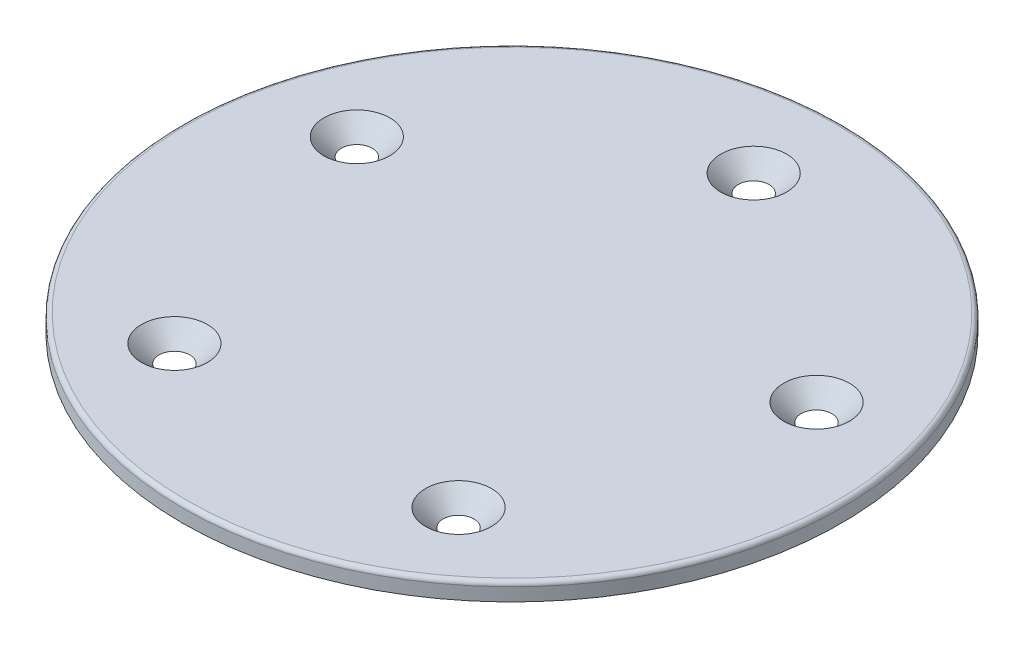
ISO-10303-21;
HEADER;
FILE_DESCRIPTION(('STEP AP214'),'2;1');
FILE_NAME('part.step','',(''),(''),'','','');
FILE_SCHEMA(('AUTOMOTIVE_DESIGN { 1 0 10303 214 1 1 1 1 }'));
ENDSEC;
DATA;
#1=APPLICATION_CONTEXT('core data for automotive mechanical design processes');
#2=APPLICATION_PROTOCOL_DEFINITION('international standard','automotive_design',2000,#1);
#3=PRODUCT_CONTEXT('',#1,'mechanical');
#4=PRODUCT('Part','Part','',(#3));
#5=PRODUCT_RELATED_PRODUCT_CATEGORY('part','',(#4));
#6=PRODUCT_DEFINITION_FORMATION('','',#4);
#7=PRODUCT_DEFINITION_CONTEXT('part definition',#1,'design');
#8=PRODUCT_DEFINITION('design','',#6,#7);
#9=PRODUCT_DEFINITION_SHAPE('','',#8);
#10=(LENGTH_UNIT() NAMED_UNIT(*) SI_UNIT(.MILLI.,.METRE.));
#11=(NAMED_UNIT(*) PLANE_ANGLE_UNIT() SI_UNIT($,.RADIAN.));
#12=(NAMED_UNIT(*) SI_UNIT($,.STERADIAN.) SOLID_ANGLE_UNIT());
#13=UNCERTAINTY_MEASURE_WITH_UNIT(LENGTH_MEASURE(1.E-05),#10,'distance_accuracy_value','');
#14=(GEOMETRIC_REPRESENTATION_CONTEXT(3) GLOBAL_UNCERTAINTY_ASSIGNED_CONTEXT((#13)) GLOBAL_UNIT_ASSIGNED_CONTEXT((#10,
#11,#12)) REPRESENTATION_CONTEXT('',''));
#15=CARTESIAN_POINT('',(0.,0.,0.));
#16=DIRECTION('',(0.,0.,1.));
#17=DIRECTION('',(1.,0.,0.));
#18=AXIS2_PLACEMENT_3D('',#15,#16,#17);
#19=CARTESIAN_POINT('',(0.,2.,0.));
#20=DIRECTION('',(0.,-1.,0.));
#21=DIRECTION('',(0.,0.,-1.));
#22=AXIS2_PLACEMENT_3D('',#19,#20,#21);
#23=CYLINDRICAL_SURFACE('',#22,37.5);
#24=CARTESIAN_POINT('',(0.,1.5,0.));
#25=DIRECTION('',(0.,1.,0.));
#26=DIRECTION('',(0.,0.,1.));
#27=AXIS2_PLACEMENT_3D('',#24,#25,#26);
#28=CIRCLE('',#27,37.5);
#29=CARTESIAN_POINT('',(0.,1.5,37.5));
#30=VERTEX_POINT('',#29);
#31=EDGE_CURVE('E10',#30,#30,#28,.F.);
#32=ORIENTED_EDGE('',*,*,#31,.T.);
#33=EDGE_LOOP('',(#32));
#34=FACE_BOUND('',#33,.T.);
#35=CARTESIAN_POINT('',(0.,0.,0.));
#36=DIRECTION('',(0.,1.,0.));
#37=DIRECTION('',(0.,0.,1.));
#38=AXIS2_PLACEMENT_3D('',#35,#36,#37);
#39=CIRCLE('',#38,37.5);
#40=CARTESIAN_POINT('',(0.,0.,37.5));
#41=VERTEX_POINT('',#40);
#42=EDGE_CURVE('E81',#41,#41,#39,.T.);
#43=ORIENTED_EDGE('',*,*,#42,.T.);
#44=EDGE_LOOP('',(#43));
#45=FACE_BOUND('',#44,.T.);
#46=ADVANCED_FACE('F45',(#34,#45),#23,.T.);
#47=CARTESIAN_POINT('',(0.,2.,0.));
#48=DIRECTION('',(0.,1.,0.));
#49=DIRECTION('',(0.,0.,1.));
#50=AXIS2_PLACEMENT_3D('',#47,#48,#49);
#51=PLANE('',#50);
#52=CARTESIAN_POINT('',(0.,2.,0.));
#53=DIRECTION('',(0.,1.,0.));
#54=DIRECTION('',(0.,0.,1.));
#55=AXIS2_PLACEMENT_3D('',#52,#53,#54);
#56=CIRCLE('',#55,37.);
#57=CARTESIAN_POINT('',(0.,2.,37.));
#58=VERTEX_POINT('',#57);
#59=EDGE_CURVE('E53',#58,#58,#56,.T.);
#60=ORIENTED_EDGE('',*,*,#59,.T.);
#61=EDGE_LOOP('',(#60));
#62=FACE_BOUND('',#61,.T.);
#63=CARTESIAN_POINT('',(-16.1640944380432,2.,22.2479673453109));
#64=DIRECTION('',(0.,1.,0.));
#65=DIRECTION('',(0.,0.,1.));
#66=AXIS2_PLACEMENT_3D('',#63,#64,#65);
#67=CIRCLE('',#66,3.75000000000004);
#68=CARTESIAN_POINT('',(-16.1640944380432,2.,25.997967345311));
#69=VERTEX_POINT('',#68);
#70=EDGE_CURVE('E58',#69,#69,#67,.F.);
#71=ORIENTED_EDGE('',*,*,#70,.T.);
#72=EDGE_LOOP('',(#71));
#73=FACE_BOUND('',#72,.T.);
#74=CARTESIAN_POINT('',(16.1640944380429,2.,22.2479673453112));
#75=DIRECTION('',(0.,1.,0.));
#76=DIRECTION('',(0.,0.,1.));
#77=AXIS2_PLACEMENT_3D('',#74,#75,#76);
#78=CIRCLE('',#77,3.75000000000004);
#79=CARTESIAN_POINT('',(16.1640944380429,2.,25.9979673453112));
#80=VERTEX_POINT('',#79);
#81=EDGE_CURVE('E63',#80,#80,#78,.F.);
#82=ORIENTED_EDGE('',*,*,#81,.T.);
#83=EDGE_LOOP('',(#82));
#84=FACE_BOUND('',#83,.T.);
#85=CARTESIAN_POINT('',(26.1540541981167,2.,-8.49796734531098));
#86=DIRECTION('',(0.,1.,0.));
#87=DIRECTION('',(0.,0.,1.));
#88=AXIS2_PLACEMENT_3D('',#85,#86,#87);
#89=CIRCLE('',#88,3.75000000000003);
#90=CARTESIAN_POINT('',(26.1540541981167,2.,-4.74796734531095));
#91=VERTEX_POINT('',#90);
#92=EDGE_CURVE('E69',#91,#91,#89,.F.);
#93=ORIENTED_EDGE('',*,*,#92,.T.);
#94=EDGE_LOOP('',(#93));
#95=FACE_BOUND('',#94,.T.);
#96=CARTESIAN_POINT('',(0.,2.,-27.5));
#97=DIRECTION('',(0.,1.,0.));
#98=DIRECTION('',(0.,0.,1.));
#99=AXIS2_PLACEMENT_3D('',#96,#97,#98);
#100=CIRCLE('',#99,3.75000000000001);
#101=CARTESIAN_POINT('',(0.,2.,-23.75));
#102=VERTEX_POINT('',#101);
#103=EDGE_CURVE('E73',#102,#102,#100,.F.);
#104=ORIENTED_EDGE('',*,*,#103,.T.);
#105=EDGE_LOOP('',(#104));
#106=FACE_BOUND('',#105,.T.);
#107=CARTESIAN_POINT('',(-26.1540541981166,2.,-8.49796734531135));
#108=DIRECTION('',(0.,1.,0.));
#109=DIRECTION('',(0.,0.,1.));
#110=AXIS2_PLACEMENT_3D('',#107,#108,#109);
#111=CIRCLE('',#110,3.75);
#112=CARTESIAN_POINT('',(-26.1540541981166,2.,-4.74796734531135));
#113=VERTEX_POINT('',#112);
#114=EDGE_CURVE('E77',#113,#113,#111,.F.);
#115=ORIENTED_EDGE('',*,*,#114,.T.);
#116=EDGE_LOOP('',(#115));
#117=FACE_BOUND('',#116,.T.);
#118=ADVANCED_FACE('F124',(#62,#73,#84,#95,#106,#117),#51,.T.);
#119=CARTESIAN_POINT('',(0.,0.,0.));
#120=DIRECTION('',(0.,1.,0.));
#121=DIRECTION('',(0.,0.,1.));
#122=AXIS2_PLACEMENT_3D('',#119,#120,#121);
#123=PLANE('',#122);
#124=CARTESIAN_POINT('',(-26.1540541981166,0.,-8.49796734531135));
#125=DIRECTION('',(0.,1.,0.));
#126=DIRECTION('',(0.,0.,1.));
#127=AXIS2_PLACEMENT_3D('',#124,#125,#126);
#128=CIRCLE('',#127,1.75);
#129=CARTESIAN_POINT('',(-26.1540541981166,0.,-6.74796734531135));
#130=VERTEX_POINT('',#129);
#131=EDGE_CURVE('E101',#130,#130,#128,.T.);
#132=ORIENTED_EDGE('',*,*,#131,.T.);
#133=EDGE_LOOP('',(#132));
#134=FACE_BOUND('',#133,.T.);
#135=CARTESIAN_POINT('',(0.,0.,-27.5));
#136=DIRECTION('',(0.,1.,0.));
#137=DIRECTION('',(0.,0.,1.));
#138=AXIS2_PLACEMENT_3D('',#135,#136,#137);
#139=CIRCLE('',#138,1.75);
#140=CARTESIAN_POINT('',(0.,0.,-25.75));
#141=VERTEX_POINT('',#140);
#142=EDGE_CURVE('E97',#141,#141,#139,.T.);
#143=ORIENTED_EDGE('',*,*,#142,.T.);
#144=EDGE_LOOP('',(#143));
#145=FACE_BOUND('',#144,.T.);
#146=CARTESIAN_POINT('',(26.1540541981167,0.,-8.49796734531098));
#147=DIRECTION('',(0.,1.,0.));
#148=DIRECTION('',(0.,0.,1.));
#149=AXIS2_PLACEMENT_3D('',#146,#147,#148);
#150=CIRCLE('',#149,1.75);
#151=CARTESIAN_POINT('',(26.1540541981167,0.,-6.74796734531098));
#152=VERTEX_POINT('',#151);
#153=EDGE_CURVE('E93',#152,#152,#150,.T.);
#154=ORIENTED_EDGE('',*,*,#153,.T.);
#155=EDGE_LOOP('',(#154));
#156=FACE_BOUND('',#155,.T.);
#157=CARTESIAN_POINT('',(16.1640944380429,0.,22.2479673453112));
#158=DIRECTION('',(0.,1.,0.));
#159=DIRECTION('',(0.,0.,1.));
#160=AXIS2_PLACEMENT_3D('',#157,#158,#159);
#161=CIRCLE('',#160,1.75);
#162=CARTESIAN_POINT('',(16.1640944380429,0.,23.9979673453112));
#163=VERTEX_POINT('',#162);
#164=EDGE_CURVE('E89',#163,#163,#161,.T.);
#165=ORIENTED_EDGE('',*,*,#164,.T.);
#166=EDGE_LOOP('',(#165));
#167=FACE_BOUND('',#166,.T.);
#168=CARTESIAN_POINT('',(-16.1640944380432,0.,22.2479673453109));
#169=DIRECTION('',(0.,1.,0.));
#170=DIRECTION('',(0.,0.,1.));
#171=AXIS2_PLACEMENT_3D('',#168,#169,#170);
#172=CIRCLE('',#171,1.75);
#173=CARTESIAN_POINT('',(-16.1640944380432,0.,23.9979673453109));
#174=VERTEX_POINT('',#173);
#175=EDGE_CURVE('E85',#174,#174,#172,.T.);
#176=ORIENTED_EDGE('',*,*,#175,.T.);
#177=EDGE_LOOP('',(#176));
#178=FACE_BOUND('',#177,.T.);
#179=ORIENTED_EDGE('',*,*,#42,.F.);
#180=EDGE_LOOP('',(#179));
#181=FACE_BOUND('',#180,.T.);
#182=ADVANCED_FACE('F106',(#134,#145,#156,#167,#178,#181),#123,.F.);
#183=CARTESIAN_POINT('',(-16.1640944380432,0.,22.2479673453109));
#184=DIRECTION('',(0.,1.,0.));
#185=DIRECTION('',(0.,0.,1.));
#186=AXIS2_PLACEMENT_3D('',#183,#184,#185);
#187=CONICAL_SURFACE('',#186,1.75,0.785398163397451);
#188=ORIENTED_EDGE('',*,*,#70,.F.);
#189=EDGE_LOOP('',(#188));
#190=FACE_BOUND('',#189,.T.);
#191=ORIENTED_EDGE('',*,*,#175,.F.);
#192=EDGE_LOOP('',(#191));
#193=FACE_BOUND('',#192,.T.);
#194=ADVANCED_FACE('F134',(#190,#193),#187,.F.);
#195=CARTESIAN_POINT('',(16.1640944380429,0.,22.2479673453112));
#196=DIRECTION('',(0.,1.,0.));
#197=DIRECTION('',(0.,0.,1.));
#198=AXIS2_PLACEMENT_3D('',#195,#196,#197);
#199=CONICAL_SURFACE('',#198,1.75,0.785398163397451);
#200=ORIENTED_EDGE('',*,*,#81,.F.);
#201=EDGE_LOOP('',(#200));
#202=FACE_BOUND('',#201,.T.);
#203=ORIENTED_EDGE('',*,*,#164,.F.);
#204=EDGE_LOOP('',(#203));
#205=FACE_BOUND('',#204,.T.);
#206=ADVANCED_FACE('F140',(#202,#205),#199,.F.);
#207=CARTESIAN_POINT('',(26.1540541981167,0.,-8.49796734531098));
#208=DIRECTION('',(0.,1.,0.));
#209=DIRECTION('',(0.,0.,1.));
#210=AXIS2_PLACEMENT_3D('',#207,#208,#209);
#211=CONICAL_SURFACE('',#210,1.75,0.785398163397448);
#212=ORIENTED_EDGE('',*,*,#92,.F.);
#213=EDGE_LOOP('',(#212));
#214=FACE_BOUND('',#213,.T.);
#215=ORIENTED_EDGE('',*,*,#153,.F.);
#216=EDGE_LOOP('',(#215));
#217=FACE_BOUND('',#216,.T.);
#218=ADVANCED_FACE('F118',(#214,#217),#211,.F.);
#219=CARTESIAN_POINT('',(0.,0.,-27.5));
#220=DIRECTION('',(0.,1.,0.));
#221=DIRECTION('',(0.,0.,1.));
#222=AXIS2_PLACEMENT_3D('',#219,#220,#221);
#223=CONICAL_SURFACE('',#222,1.75,0.785398163397448);
#224=ORIENTED_EDGE('',*,*,#103,.F.);
#225=EDGE_LOOP('',(#224));
#226=FACE_BOUND('',#225,.T.);
#227=ORIENTED_EDGE('',*,*,#142,.F.);
#228=EDGE_LOOP('',(#227));
#229=FACE_BOUND('',#228,.T.);
#230=ADVANCED_FACE('F111',(#226,#229),#223,.F.);
#231=CARTESIAN_POINT('',(-26.1540541981166,0.,-8.49796734531135));
#232=DIRECTION('',(0.,1.,0.));
#233=DIRECTION('',(0.,0.,1.));
#234=AXIS2_PLACEMENT_3D('',#231,#232,#233);
#235=CONICAL_SURFACE('',#234,1.75,0.785398163397448);
#236=ORIENTED_EDGE('',*,*,#114,.F.);
#237=EDGE_LOOP('',(#236));
#238=FACE_BOUND('',#237,.T.);
#239=ORIENTED_EDGE('',*,*,#131,.F.);
#240=EDGE_LOOP('',(#239));
#241=FACE_BOUND('',#240,.T.);
#242=ADVANCED_FACE('F109',(#238,#241),#235,.F.);
#243=CARTESIAN_POINT('',(0.,1.5,0.));
#244=DIRECTION('',(0.,1.,0.));
#245=DIRECTION('',(0.,0.,1.));
#246=AXIS2_PLACEMENT_3D('',#243,#244,#245);
#247=TOROIDAL_SURFACE('',#246,37.,0.5);
#248=ORIENTED_EDGE('',*,*,#31,.F.);
#249=EDGE_LOOP('',(#248));
#250=FACE_BOUND('',#249,.T.);
#251=ORIENTED_EDGE('',*,*,#59,.F.);
#252=EDGE_LOOP('',(#251));
#253=FACE_BOUND('',#252,.T.);
#254=ADVANCED_FACE('F47',(#250,#253),#247,.T.);
#255=CLOSED_SHELL('',(#46,#118,#182,#194,#206,#218,#230,#242,#254));
#256=MANIFOLD_SOLID_BREP('B2',#255);
#257=ADVANCED_BREP_SHAPE_REPRESENTATION('',(#18,#256),#14);
#258=SHAPE_DEFINITION_REPRESENTATION(#9,#257);
ENDSEC;
END-ISO-10303-21;
